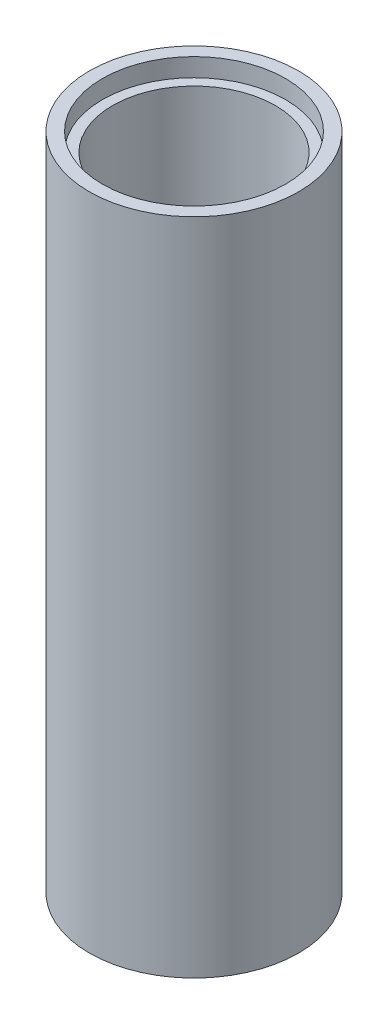
ISO-10303-21;
HEADER;
FILE_DESCRIPTION(('STEP AP214'),'2;1');
FILE_NAME('part.step','',(''),(''),'','','');
FILE_SCHEMA(('AUTOMOTIVE_DESIGN { 1 0 10303 214 1 1 1 1 }'));
ENDSEC;
DATA;
#1=APPLICATION_CONTEXT('core data for automotive mechanical design processes');
#2=APPLICATION_PROTOCOL_DEFINITION('international standard','automotive_design',2000,#1);
#3=PRODUCT_CONTEXT('',#1,'mechanical');
#4=PRODUCT('Part','Part','',(#3));
#5=PRODUCT_RELATED_PRODUCT_CATEGORY('part','',(#4));
#6=PRODUCT_DEFINITION_FORMATION('','',#4);
#7=PRODUCT_DEFINITION_CONTEXT('part definition',#1,'design');
#8=PRODUCT_DEFINITION('design','',#6,#7);
#9=PRODUCT_DEFINITION_SHAPE('','',#8);
#10=(LENGTH_UNIT() NAMED_UNIT(*) SI_UNIT(.MILLI.,.METRE.));
#11=(NAMED_UNIT(*) PLANE_ANGLE_UNIT() SI_UNIT($,.RADIAN.));
#12=(NAMED_UNIT(*) SI_UNIT($,.STERADIAN.) SOLID_ANGLE_UNIT());
#13=UNCERTAINTY_MEASURE_WITH_UNIT(LENGTH_MEASURE(1.E-05),#10,'distance_accuracy_value','');
#14=(GEOMETRIC_REPRESENTATION_CONTEXT(3) GLOBAL_UNCERTAINTY_ASSIGNED_CONTEXT((#13)) GLOBAL_UNIT_ASSIGNED_CONTEXT((#10,
#11,#12)) REPRESENTATION_CONTEXT('',''));
#15=CARTESIAN_POINT('',(0.,0.,0.));
#16=DIRECTION('',(0.,0.,1.));
#17=DIRECTION('',(1.,0.,0.));
#18=AXIS2_PLACEMENT_3D('',#15,#16,#17);
#19=CARTESIAN_POINT('',(0.,360.,0.));
#20=DIRECTION('',(0.,-1.,0.));
#21=DIRECTION('',(0.,0.,-1.));
#22=AXIS2_PLACEMENT_3D('',#19,#20,#21);
#23=CYLINDRICAL_SURFACE('',#22,44.45);
#24=CARTESIAN_POINT('',(0.,0.,0.));
#25=DIRECTION('',(0.,1.,0.));
#26=DIRECTION('',(0.,0.,1.));
#27=AXIS2_PLACEMENT_3D('',#24,#25,#26);
#28=CIRCLE('',#27,44.45);
#29=CARTESIAN_POINT('',(0.,0.,-44.45));
#30=VERTEX_POINT('',#29);
#31=EDGE_CURVE('E55',#30,#30,#28,.T.);
#32=CARTESIAN_POINT('',(0.,350.,0.));
#33=DIRECTION('',(0.,1.,0.));
#34=DIRECTION('',(0.,0.,1.));
#35=AXIS2_PLACEMENT_3D('',#32,#33,#34);
#36=CIRCLE('',#35,44.45);
#37=CARTESIAN_POINT('',(0.,350.,-44.45));
#38=VERTEX_POINT('',#37);
#39=EDGE_CURVE('E44',#38,#38,#36,.T.);
#40=CARTESIAN_POINT('',(0.,0.,-44.45));
#41=CARTESIAN_POINT('',(0.,3.64583333333327,-44.45));
#42=CARTESIAN_POINT('',(0.,7.29166666666661,-44.45));
#43=CARTESIAN_POINT('',(0.,14.5833333333333,-44.45));
#44=CARTESIAN_POINT('',(0.,18.2291666666666,-44.45));
#45=CARTESIAN_POINT('',(0.,25.5208333333333,-44.45));
#46=CARTESIAN_POINT('',(0.,29.1666666666666,-44.45));
#47=CARTESIAN_POINT('',(0.,36.4583333333333,-44.45));
#48=CARTESIAN_POINT('',(0.,40.1041666666666,-44.45));
#49=CARTESIAN_POINT('',(0.,47.3958333333333,-44.45));
#50=CARTESIAN_POINT('',(0.,51.0416666666666,-44.45));
#51=CARTESIAN_POINT('',(0.,58.3333333333333,-44.45));
#52=CARTESIAN_POINT('',(0.,61.9791666666666,-44.45));
#53=CARTESIAN_POINT('',(0.,69.2708333333333,-44.45));
#54=CARTESIAN_POINT('',(0.,72.9166666666666,-44.45));
#55=CARTESIAN_POINT('',(0.,80.2083333333333,-44.45));
#56=CARTESIAN_POINT('',(0.,83.8541666666666,-44.45));
#57=CARTESIAN_POINT('',(0.,91.1458333333333,-44.45));
#58=CARTESIAN_POINT('',(0.,94.7916666666666,-44.45));
#59=CARTESIAN_POINT('',(0.,102.083333333333,-44.45));
#60=CARTESIAN_POINT('',(0.,105.729166666667,-44.45));
#61=CARTESIAN_POINT('',(0.,113.020833333333,-44.45));
#62=CARTESIAN_POINT('',(0.,116.666666666667,-44.45));
#63=CARTESIAN_POINT('',(0.,123.958333333333,-44.45));
#64=CARTESIAN_POINT('',(0.,127.604166666667,-44.45));
#65=CARTESIAN_POINT('',(0.,134.895833333333,-44.45));
#66=CARTESIAN_POINT('',(0.,138.541666666667,-44.45));
#67=CARTESIAN_POINT('',(0.,145.833333333333,-44.45));
#68=CARTESIAN_POINT('',(0.,149.479166666667,-44.45));
#69=CARTESIAN_POINT('',(0.,156.770833333333,-44.45));
#70=CARTESIAN_POINT('',(0.,160.416666666667,-44.45));
#71=CARTESIAN_POINT('',(0.,167.708333333333,-44.45));
#72=CARTESIAN_POINT('',(0.,171.354166666667,-44.45));
#73=CARTESIAN_POINT('',(0.,178.645833333333,-44.45));
#74=CARTESIAN_POINT('',(0.,182.291666666667,-44.45));
#75=CARTESIAN_POINT('',(0.,189.583333333333,-44.45));
#76=CARTESIAN_POINT('',(0.,193.229166666667,-44.45));
#77=CARTESIAN_POINT('',(0.,200.520833333333,-44.45));
#78=CARTESIAN_POINT('',(0.,204.166666666667,-44.45));
#79=CARTESIAN_POINT('',(0.,211.458333333333,-44.45));
#80=CARTESIAN_POINT('',(0.,215.104166666667,-44.45));
#81=CARTESIAN_POINT('',(0.,222.395833333333,-44.45));
#82=CARTESIAN_POINT('',(0.,226.041666666667,-44.45));
#83=CARTESIAN_POINT('',(0.,233.333333333333,-44.45));
#84=CARTESIAN_POINT('',(0.,236.979166666667,-44.45));
#85=CARTESIAN_POINT('',(0.,244.270833333333,-44.45));
#86=CARTESIAN_POINT('',(0.,247.916666666667,-44.45));
#87=CARTESIAN_POINT('',(0.,255.208333333333,-44.45));
#88=CARTESIAN_POINT('',(0.,258.854166666667,-44.45));
#89=CARTESIAN_POINT('',(0.,266.145833333333,-44.45));
#90=CARTESIAN_POINT('',(0.,269.791666666667,-44.45));
#91=CARTESIAN_POINT('',(0.,277.083333333333,-44.45));
#92=CARTESIAN_POINT('',(0.,280.729166666667,-44.45));
#93=CARTESIAN_POINT('',(0.,288.020833333333,-44.45));
#94=CARTESIAN_POINT('',(0.,291.666666666667,-44.45));
#95=CARTESIAN_POINT('',(0.,298.958333333333,-44.45));
#96=CARTESIAN_POINT('',(0.,302.604166666667,-44.45));
#97=CARTESIAN_POINT('',(0.,309.895833333333,-44.45));
#98=CARTESIAN_POINT('',(0.,313.541666666667,-44.45));
#99=CARTESIAN_POINT('',(0.,320.833333333333,-44.45));
#100=CARTESIAN_POINT('',(0.,324.479166666667,-44.45));
#101=CARTESIAN_POINT('',(0.,331.770833333333,-44.45));
#102=CARTESIAN_POINT('',(0.,335.416666666667,-44.45));
#103=CARTESIAN_POINT('',(0.,342.708333333333,-44.45));
#104=CARTESIAN_POINT('',(0.,346.354166666667,-44.45));
#105=CARTESIAN_POINT('',(0.,350.,-44.45));
#106=B_SPLINE_CURVE_WITH_KNOTS('',3,(#40,#41,#42,#43,#44,#45,#46,#47,#48,#49,#50,#51,#52,#53,
#54,#55,#56,#57,#58,#59,#60,#61,#62,#63,#64,#65,#66,#67,#68,#69,#70,#71,#72,#73,#74,#75,#76,#77,
#78,#79,#80,#81,#82,#83,#84,#85,#86,#87,#88,#89,#90,#91,#92,#93,#94,#95,#96,#97,#98,#99,#100,
#101,#102,#103,#104,#105),.UNSPECIFIED.,.F.,.F.,(4,2,2,2,2,2,2,2,2,2,2,2,2,2,2,2,2,2,2,2,2,2,2,
2,2,2,2,2,2,2,2,2,4),(0.,10.9375,21.875,32.8125,43.75,54.6875,65.625,76.5625,87.5,98.4375,
109.375,120.3125,131.25,142.1875,153.125,164.0625,175.,185.9375,196.875,207.8125,218.75,
229.6875,240.625,251.5625,262.5,273.4375,284.375,295.3125,306.25,317.1875,328.125,339.0625,
350.),.UNSPECIFIED.);
#107=EDGE_CURVE('BSEAM40',#30,#38,#106,.T.);
#108=ORIENTED_EDGE('',*,*,#31,.F.);
#109=ORIENTED_EDGE('',*,*,#39,.T.);
#110=ORIENTED_EDGE('',*,*,#107,.T.);
#111=ORIENTED_EDGE('',*,*,#107,.F.);
#112=EDGE_LOOP('',(#108,#110,#109,#111));
#113=FACE_BOUND('',#112,.T.);
#114=ADVANCED_FACE('F40',(#113),#23,.F.);
#115=CARTESIAN_POINT('',(0.,360.,0.));
#116=DIRECTION('',(0.,1.,0.));
#117=DIRECTION('',(0.,0.,1.));
#118=AXIS2_PLACEMENT_3D('',#115,#116,#117);
#119=PLANE('',#118);
#120=CARTESIAN_POINT('',(0.,360.,0.));
#121=DIRECTION('',(0.,1.,0.));
#122=DIRECTION('',(0.,0.,1.));
#123=AXIS2_PLACEMENT_3D('',#120,#121,#122);
#124=CIRCLE('',#123,50.);
#125=CARTESIAN_POINT('',(0.,360.,50.));
#126=VERTEX_POINT('',#125);
#127=EDGE_CURVE('E60',#126,#126,#124,.T.);
#128=ORIENTED_EDGE('',*,*,#127,.F.);
#129=EDGE_LOOP('',(#128));
#130=FACE_BOUND('',#129,.T.);
#131=CARTESIAN_POINT('',(0.,360.,0.));
#132=DIRECTION('',(0.,1.,0.));
#133=DIRECTION('',(0.,0.,1.));
#134=AXIS2_PLACEMENT_3D('',#131,#132,#133);
#135=CIRCLE('',#134,57.15);
#136=CARTESIAN_POINT('',(0.,360.,-57.15));
#137=VERTEX_POINT('',#136);
#138=EDGE_CURVE('E10',#137,#137,#135,.T.);
#139=ORIENTED_EDGE('',*,*,#138,.T.);
#140=EDGE_LOOP('',(#139));
#141=FACE_BOUND('',#140,.T.);
#142=ADVANCED_FACE('F84',(#130,#141),#119,.T.);
#143=CARTESIAN_POINT('',(0.,0.,0.));
#144=DIRECTION('',(0.,1.,0.));
#145=DIRECTION('',(0.,0.,1.));
#146=AXIS2_PLACEMENT_3D('',#143,#144,#145);
#147=PLANE('',#146);
#148=CARTESIAN_POINT('',(0.,0.,0.));
#149=DIRECTION('',(0.,1.,0.));
#150=DIRECTION('',(0.,0.,1.));
#151=AXIS2_PLACEMENT_3D('',#148,#149,#150);
#152=CIRCLE('',#151,57.15);
#153=CARTESIAN_POINT('',(0.,0.,-57.15));
#154=VERTEX_POINT('',#153);
#155=EDGE_CURVE('E49',#154,#154,#152,.T.);
#156=ORIENTED_EDGE('',*,*,#155,.F.);
#157=EDGE_LOOP('',(#156));
#158=FACE_BOUND('',#157,.T.);
#159=ORIENTED_EDGE('',*,*,#31,.T.);
#160=EDGE_LOOP('',(#159));
#161=FACE_BOUND('',#160,.T.);
#162=ADVANCED_FACE('F90',(#158,#161),#147,.F.);
#163=CARTESIAN_POINT('',(0.,360.,0.));
#164=DIRECTION('',(0.,-1.,0.));
#165=DIRECTION('',(0.,0.,-1.));
#166=AXIS2_PLACEMENT_3D('',#163,#164,#165);
#167=CYLINDRICAL_SURFACE('',#166,57.15);
#168=CARTESIAN_POINT('',(0.,360.,-57.15));
#169=CARTESIAN_POINT('',(0.,356.25,-57.15));
#170=CARTESIAN_POINT('',(0.,352.5,-57.15));
#171=CARTESIAN_POINT('',(0.,345.,-57.15));
#172=CARTESIAN_POINT('',(0.,341.25,-57.15));
#173=CARTESIAN_POINT('',(0.,333.75,-57.15));
#174=CARTESIAN_POINT('',(0.,330.,-57.15));
#175=CARTESIAN_POINT('',(0.,322.5,-57.15));
#176=CARTESIAN_POINT('',(0.,318.75,-57.15));
#177=CARTESIAN_POINT('',(0.,311.25,-57.15));
#178=CARTESIAN_POINT('',(0.,307.5,-57.15));
#179=CARTESIAN_POINT('',(0.,300.,-57.15));
#180=CARTESIAN_POINT('',(0.,296.25,-57.15));
#181=CARTESIAN_POINT('',(0.,288.75,-57.15));
#182=CARTESIAN_POINT('',(0.,285.,-57.15));
#183=CARTESIAN_POINT('',(0.,277.5,-57.15));
#184=CARTESIAN_POINT('',(0.,273.75,-57.15));
#185=CARTESIAN_POINT('',(0.,266.25,-57.15));
#186=CARTESIAN_POINT('',(0.,262.5,-57.15));
#187=CARTESIAN_POINT('',(0.,255.,-57.15));
#188=CARTESIAN_POINT('',(0.,251.25,-57.15));
#189=CARTESIAN_POINT('',(0.,243.75,-57.15));
#190=CARTESIAN_POINT('',(0.,240.,-57.15));
#191=CARTESIAN_POINT('',(0.,232.5,-57.15));
#192=CARTESIAN_POINT('',(0.,228.75,-57.15));
#193=CARTESIAN_POINT('',(0.,221.25,-57.15));
#194=CARTESIAN_POINT('',(0.,217.5,-57.15));
#195=CARTESIAN_POINT('',(0.,210.,-57.15));
#196=CARTESIAN_POINT('',(0.,206.25,-57.15));
#197=CARTESIAN_POINT('',(0.,198.75,-57.15));
#198=CARTESIAN_POINT('',(0.,195.,-57.15));
#199=CARTESIAN_POINT('',(0.,187.5,-57.15));
#200=CARTESIAN_POINT('',(0.,183.75,-57.15));
#201=CARTESIAN_POINT('',(0.,176.25,-57.15));
#202=CARTESIAN_POINT('',(0.,172.5,-57.15));
#203=CARTESIAN_POINT('',(0.,165.,-57.15));
#204=CARTESIAN_POINT('',(0.,161.25,-57.15));
#205=CARTESIAN_POINT('',(0.,153.75,-57.15));
#206=CARTESIAN_POINT('',(0.,150.,-57.15));
#207=CARTESIAN_POINT('',(0.,142.5,-57.15));
#208=CARTESIAN_POINT('',(0.,138.75,-57.15));
#209=CARTESIAN_POINT('',(0.,131.25,-57.15));
#210=CARTESIAN_POINT('',(0.,127.5,-57.15));
#211=CARTESIAN_POINT('',(0.,120.,-57.15));
#212=CARTESIAN_POINT('',(0.,116.25,-57.15));
#213=CARTESIAN_POINT('',(0.,108.75,-57.15));
#214=CARTESIAN_POINT('',(0.,105.,-57.15));
#215=CARTESIAN_POINT('',(0.,97.5,-57.15));
#216=CARTESIAN_POINT('',(0.,93.75,-57.15));
#217=CARTESIAN_POINT('',(0.,86.25,-57.15));
#218=CARTESIAN_POINT('',(0.,82.4999999999999,-57.15));
#219=CARTESIAN_POINT('',(0.,74.9999999999999,-57.15));
#220=CARTESIAN_POINT('',(0.,71.2499999999999,-57.15));
#221=CARTESIAN_POINT('',(0.,63.75,-57.15));
#222=CARTESIAN_POINT('',(0.,60.,-57.15));
#223=CARTESIAN_POINT('',(0.,52.5,-57.15));
#224=CARTESIAN_POINT('',(0.,48.7499999999999,-57.15));
#225=CARTESIAN_POINT('',(0.,41.2499999999999,-57.15));
#226=CARTESIAN_POINT('',(0.,37.4999999999999,-57.15));
#227=CARTESIAN_POINT('',(0.,30.,-57.15));
#228=CARTESIAN_POINT('',(0.,26.25,-57.15));
#229=CARTESIAN_POINT('',(0.,18.75,-57.15));
#230=CARTESIAN_POINT('',(0.,14.9999999999999,-57.15));
#231=CARTESIAN_POINT('',(0.,7.49999999999993,-57.15));
#232=CARTESIAN_POINT('',(0.,3.74999999999994,-57.15));
#233=CARTESIAN_POINT('',(0.,0.,-57.15));
#234=B_SPLINE_CURVE_WITH_KNOTS('',3,(#168,#169,#170,#171,#172,#173,#174,#175,#176,#177,#178,
#179,#180,#181,#182,#183,#184,#185,#186,#187,#188,#189,#190,#191,#192,#193,#194,#195,#196,#197,
#198,#199,#200,#201,#202,#203,#204,#205,#206,#207,#208,#209,#210,#211,#212,#213,#214,#215,#216,
#217,#218,#219,#220,#221,#222,#223,#224,#225,#226,#227,#228,#229,#230,#231,#232,#233),
.UNSPECIFIED.,.F.,.F.,(4,2,2,2,2,2,2,2,2,2,2,2,2,2,2,2,2,2,2,2,2,2,2,2,2,2,2,2,2,2,2,2,4),(0.,
11.25,22.5,33.7499999999999,45.,56.25,67.4999999999999,78.75,90.,101.25,112.5,123.75,135.,
146.25,157.5,168.75,180.,191.25,202.5,213.75,225.,236.25,247.5,258.75,270.,281.25,292.5,303.75,
315.,326.25,337.5,348.75,360.),.UNSPECIFIED.);
#235=EDGE_CURVE('BSEAM42',#137,#154,#234,.T.);
#236=ORIENTED_EDGE('',*,*,#138,.F.);
#237=ORIENTED_EDGE('',*,*,#155,.T.);
#238=ORIENTED_EDGE('',*,*,#235,.T.);
#239=ORIENTED_EDGE('',*,*,#235,.F.);
#240=EDGE_LOOP('',(#236,#238,#237,#239));
#241=FACE_BOUND('',#240,.T.);
#242=ADVANCED_FACE('F42',(#241),#167,.T.);
#243=CARTESIAN_POINT('',(0.,350.,0.));
#244=DIRECTION('',(0.,1.,0.));
#245=DIRECTION('',(0.,0.,1.));
#246=AXIS2_PLACEMENT_3D('',#243,#244,#245);
#247=CYLINDRICAL_SURFACE('',#246,50.);
#248=CARTESIAN_POINT('',(0.,350.,0.));
#249=DIRECTION('',(0.,1.,0.));
#250=DIRECTION('',(0.,0.,1.));
#251=AXIS2_PLACEMENT_3D('',#248,#249,#250);
#252=CIRCLE('',#251,50.);
#253=CARTESIAN_POINT('',(0.,350.,50.));
#254=VERTEX_POINT('',#253);
#255=EDGE_CURVE('E64',#254,#254,#252,.T.);
#256=ORIENTED_EDGE('',*,*,#255,.F.);
#257=EDGE_LOOP('',(#256));
#258=FACE_BOUND('',#257,.T.);
#259=ORIENTED_EDGE('',*,*,#127,.T.);
#260=EDGE_LOOP('',(#259));
#261=FACE_BOUND('',#260,.T.);
#262=ADVANCED_FACE('F76',(#258,#261),#247,.F.);
#263=CARTESIAN_POINT('',(0.,350.,0.));
#264=DIRECTION('',(0.,1.,0.));
#265=DIRECTION('',(0.,0.,1.));
#266=AXIS2_PLACEMENT_3D('',#263,#264,#265);
#267=PLANE('',#266);
#268=ORIENTED_EDGE('',*,*,#39,.F.);
#269=EDGE_LOOP('',(#268));
#270=FACE_BOUND('',#269,.T.);
#271=ORIENTED_EDGE('',*,*,#255,.T.);
#272=EDGE_LOOP('',(#271));
#273=FACE_BOUND('',#272,.T.);
#274=ADVANCED_FACE('F74',(#270,#273),#267,.T.);
#275=CLOSED_SHELL('',(#114,#142,#162,#242,#262,#274));
#276=MANIFOLD_SOLID_BREP('B2',#275);
#277=ADVANCED_BREP_SHAPE_REPRESENTATION('',(#18,#276),#14);
#278=SHAPE_DEFINITION_REPRESENTATION(#9,#277);
ENDSEC;
END-ISO-10303-21;
